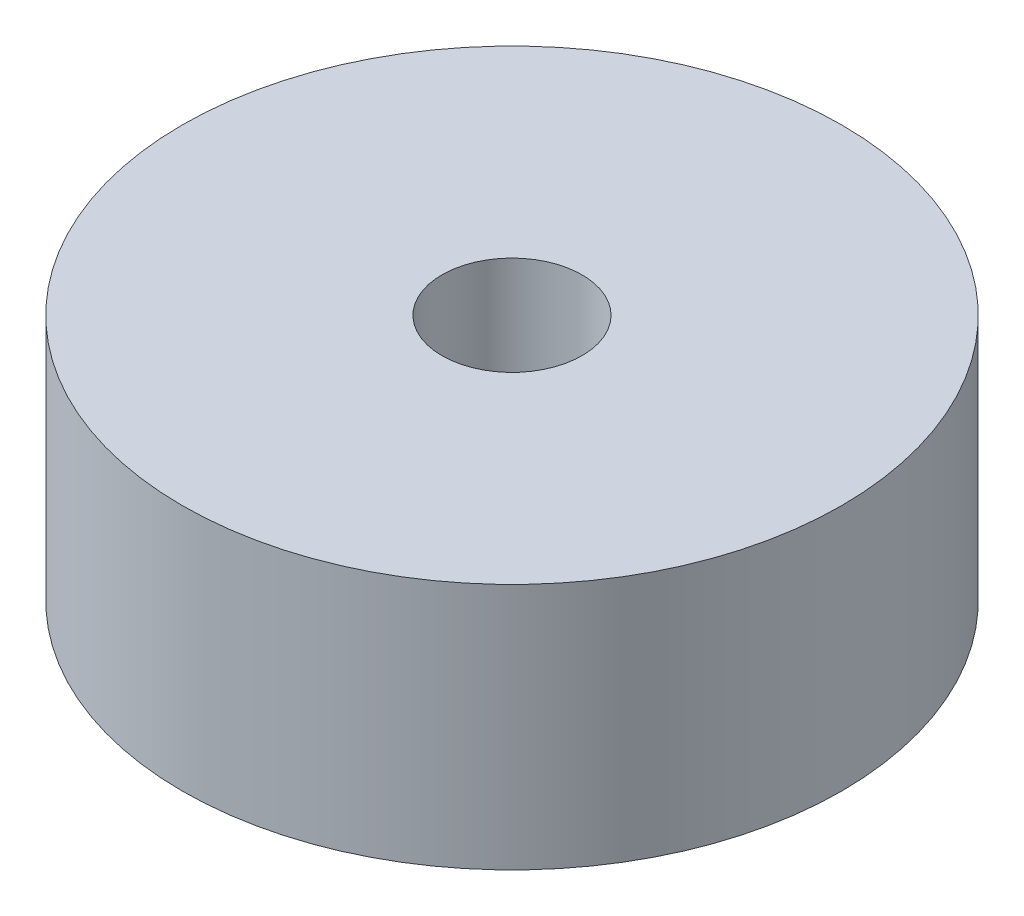
ISO-10303-21;
HEADER;
FILE_DESCRIPTION(('STEP AP214'),'2;1');
FILE_NAME('part.step','',(''),(''),'','','');
FILE_SCHEMA(('AUTOMOTIVE_DESIGN { 1 0 10303 214 1 1 1 1 }'));
ENDSEC;
DATA;
#1=APPLICATION_CONTEXT('core data for automotive mechanical design processes');
#2=APPLICATION_PROTOCOL_DEFINITION('international standard','automotive_design',2000,#1);
#3=PRODUCT_CONTEXT('',#1,'mechanical');
#4=PRODUCT('Part','Part','',(#3));
#5=PRODUCT_RELATED_PRODUCT_CATEGORY('part','',(#4));
#6=PRODUCT_DEFINITION_FORMATION('','',#4);
#7=PRODUCT_DEFINITION_CONTEXT('part definition',#1,'design');
#8=PRODUCT_DEFINITION('design','',#6,#7);
#9=PRODUCT_DEFINITION_SHAPE('','',#8);
#10=(LENGTH_UNIT() NAMED_UNIT(*) SI_UNIT(.MILLI.,.METRE.));
#11=(NAMED_UNIT(*) PLANE_ANGLE_UNIT() SI_UNIT($,.RADIAN.));
#12=(NAMED_UNIT(*) SI_UNIT($,.STERADIAN.) SOLID_ANGLE_UNIT());
#13=UNCERTAINTY_MEASURE_WITH_UNIT(LENGTH_MEASURE(1.E-05),#10,'distance_accuracy_value','');
#14=(GEOMETRIC_REPRESENTATION_CONTEXT(3) GLOBAL_UNCERTAINTY_ASSIGNED_CONTEXT((#13)) GLOBAL_UNIT_ASSIGNED_CONTEXT((#10,
#11,#12)) REPRESENTATION_CONTEXT('',''));
#15=CARTESIAN_POINT('',(0.,0.,0.));
#16=DIRECTION('',(0.,0.,1.));
#17=DIRECTION('',(1.,0.,0.));
#18=AXIS2_PLACEMENT_3D('',#15,#16,#17);
#19=CARTESIAN_POINT('',(0.,6.,0.));
#20=DIRECTION('',(0.,1.,0.));
#21=DIRECTION('',(0.,0.,1.));
#22=AXIS2_PLACEMENT_3D('',#19,#20,#21);
#23=PLANE('',#22);
#24=CARTESIAN_POINT('',(0.,6.,0.));
#25=DIRECTION('',(0.,1.,0.));
#26=DIRECTION('',(0.,0.,1.));
#27=AXIS2_PLACEMENT_3D('',#24,#25,#26);
#28=CIRCLE('',#27,8.);
#29=CARTESIAN_POINT('',(0.,6.,8.));
#30=VERTEX_POINT('',#29);
#31=EDGE_CURVE('E10',#30,#30,#28,.T.);
#32=ORIENTED_EDGE('',*,*,#31,.T.);
#33=EDGE_LOOP('',(#32));
#34=FACE_BOUND('',#33,.T.);
#35=CARTESIAN_POINT('',(0.,6.,0.));
#36=DIRECTION('',(0.,1.,0.));
#37=DIRECTION('',(0.,0.,1.));
#38=AXIS2_PLACEMENT_3D('',#35,#36,#37);
#39=CIRCLE('',#38,1.7);
#40=CARTESIAN_POINT('',(0.,6.,1.7));
#41=VERTEX_POINT('',#40);
#42=EDGE_CURVE('E55',#41,#41,#39,.T.);
#43=ORIENTED_EDGE('',*,*,#42,.F.);
#44=EDGE_LOOP('',(#43));
#45=FACE_BOUND('',#44,.T.);
#46=ADVANCED_FACE('F41',(#34,#45),#23,.T.);
#47=CARTESIAN_POINT('',(0.,0.,0.));
#48=DIRECTION('',(0.,1.,0.));
#49=DIRECTION('',(0.,0.,1.));
#50=AXIS2_PLACEMENT_3D('',#47,#48,#49);
#51=PLANE('',#50);
#52=CARTESIAN_POINT('',(0.,0.,0.));
#53=DIRECTION('',(0.,1.,0.));
#54=DIRECTION('',(0.,0.,1.));
#55=AXIS2_PLACEMENT_3D('',#52,#53,#54);
#56=CIRCLE('',#55,8.);
#57=CARTESIAN_POINT('',(0.,0.,8.));
#58=VERTEX_POINT('',#57);
#59=EDGE_CURVE('E44',#58,#58,#56,.T.);
#60=ORIENTED_EDGE('',*,*,#59,.F.);
#61=EDGE_LOOP('',(#60));
#62=FACE_BOUND('',#61,.T.);
#63=CARTESIAN_POINT('',(0.,0.,0.));
#64=DIRECTION('',(0.,1.,0.));
#65=DIRECTION('',(0.,0.,1.));
#66=AXIS2_PLACEMENT_3D('',#63,#64,#65);
#67=CIRCLE('',#66,1.7);
#68=CARTESIAN_POINT('',(0.,0.,1.7));
#69=VERTEX_POINT('',#68);
#70=EDGE_CURVE('E53',#69,#69,#67,.T.);
#71=ORIENTED_EDGE('',*,*,#70,.T.);
#72=EDGE_LOOP('',(#71));
#73=FACE_BOUND('',#72,.T.);
#74=ADVANCED_FACE('F65',(#62,#73),#51,.F.);
#75=CARTESIAN_POINT('',(0.,6.,0.));
#76=DIRECTION('',(0.,-1.,0.));
#77=DIRECTION('',(0.,0.,-1.));
#78=AXIS2_PLACEMENT_3D('',#75,#76,#77);
#79=CYLINDRICAL_SURFACE('',#78,8.);
#80=ORIENTED_EDGE('',*,*,#31,.F.);
#81=EDGE_LOOP('',(#80));
#82=FACE_BOUND('',#81,.T.);
#83=ORIENTED_EDGE('',*,*,#59,.T.);
#84=EDGE_LOOP('',(#83));
#85=FACE_BOUND('',#84,.T.);
#86=ADVANCED_FACE('F43',(#82,#85),#79,.T.);
#87=CARTESIAN_POINT('',(0.,6.,0.));
#88=DIRECTION('',(0.,-1.,0.));
#89=DIRECTION('',(0.,0.,-1.));
#90=AXIS2_PLACEMENT_3D('',#87,#88,#89);
#91=CYLINDRICAL_SURFACE('',#90,1.7);
#92=ORIENTED_EDGE('',*,*,#42,.T.);
#93=EDGE_LOOP('',(#92));
#94=FACE_BOUND('',#93,.T.);
#95=ORIENTED_EDGE('',*,*,#70,.F.);
#96=EDGE_LOOP('',(#95));
#97=FACE_BOUND('',#96,.T.);
#98=ADVANCED_FACE('F58',(#94,#97),#91,.F.);
#99=CLOSED_SHELL('',(#46,#74,#86,#98));
#100=MANIFOLD_SOLID_BREP('B2',#99);
#101=ADVANCED_BREP_SHAPE_REPRESENTATION('',(#18,#100),#14);
#102=SHAPE_DEFINITION_REPRESENTATION(#9,#101);
ENDSEC;
END-ISO-10303-21;
